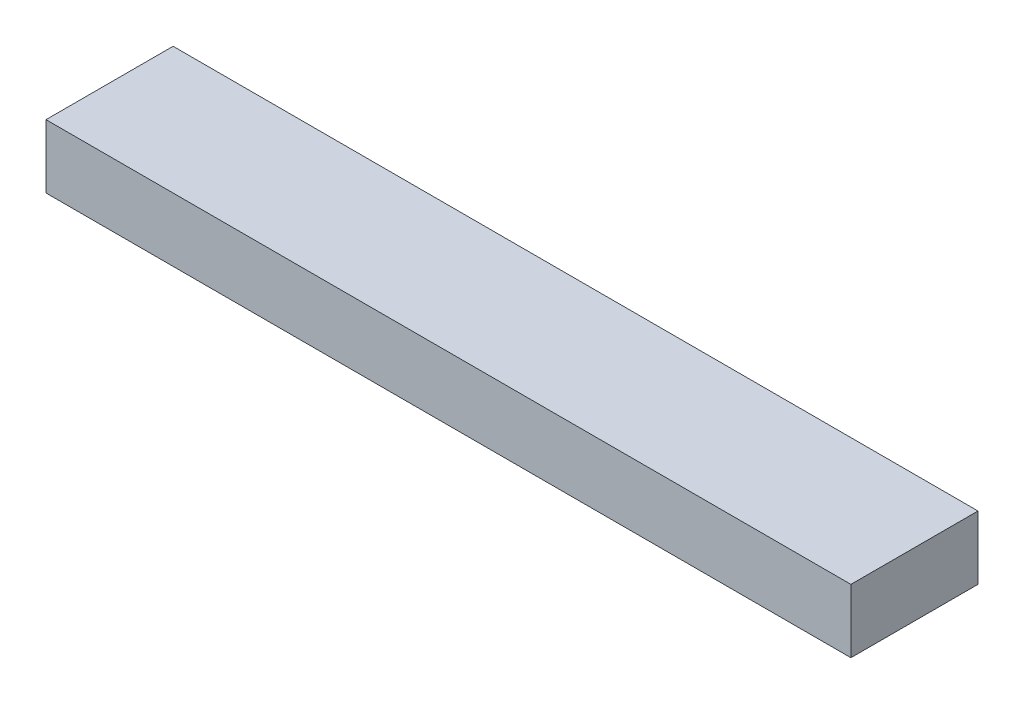
ISO-10303-21;
HEADER;
FILE_DESCRIPTION(('STEP AP214'),'2;1');
FILE_NAME('part.step','',(''),(''),'','','');
FILE_SCHEMA(('AUTOMOTIVE_DESIGN { 1 0 10303 214 1 1 1 1 }'));
ENDSEC;
DATA;
#1=APPLICATION_CONTEXT('core data for automotive mechanical design processes');
#2=APPLICATION_PROTOCOL_DEFINITION('international standard','automotive_design',2000,#1);
#3=PRODUCT_CONTEXT('',#1,'mechanical');
#4=PRODUCT('Part','Part','',(#3));
#5=PRODUCT_RELATED_PRODUCT_CATEGORY('part','',(#4));
#6=PRODUCT_DEFINITION_FORMATION('','',#4);
#7=PRODUCT_DEFINITION_CONTEXT('part definition',#1,'design');
#8=PRODUCT_DEFINITION('design','',#6,#7);
#9=PRODUCT_DEFINITION_SHAPE('','',#8);
#10=(LENGTH_UNIT() NAMED_UNIT(*) SI_UNIT(.MILLI.,.METRE.));
#11=(NAMED_UNIT(*) PLANE_ANGLE_UNIT() SI_UNIT($,.RADIAN.));
#12=(NAMED_UNIT(*) SI_UNIT($,.STERADIAN.) SOLID_ANGLE_UNIT());
#13=UNCERTAINTY_MEASURE_WITH_UNIT(LENGTH_MEASURE(1.E-05),#10,'distance_accuracy_value','');
#14=(GEOMETRIC_REPRESENTATION_CONTEXT(3) GLOBAL_UNCERTAINTY_ASSIGNED_CONTEXT((#13)) GLOBAL_UNIT_ASSIGNED_CONTEXT((#10,
#11,#12)) REPRESENTATION_CONTEXT('',''));
#15=CARTESIAN_POINT('',(0.,0.,0.));
#16=DIRECTION('',(0.,0.,1.));
#17=DIRECTION('',(1.,0.,0.));
#18=AXIS2_PLACEMENT_3D('',#15,#16,#17);
#19=CARTESIAN_POINT('',(151.999999999999,24.,24.0000000000008));
#20=DIRECTION('',(-1.,0.,0.));
#21=DIRECTION('',(0.,0.,1.00000000000003));
#22=AXIS2_PLACEMENT_3D('',#19,#20,#21);
#23=PLANE('',#22);
#24=DIRECTION('',(0.,0.,-1.00000000000003));
#25=VECTOR('',#24,1.);
#26=CARTESIAN_POINT('',(151.999999999999,0.,24.0000000000014));
#27=LINE('',#26,#25);
#28=CARTESIAN_POINT('',(151.999999999999,0.,24.0000000000014));
#29=VERTEX_POINT('',#28);
#30=CARTESIAN_POINT('',(151.999999999999,0.,-24.0000000000002));
#31=VERTEX_POINT('',#30);
#32=EDGE_CURVE('E110',#29,#31,#27,.T.);
#33=ORIENTED_EDGE('',*,*,#32,.T.);
#34=DIRECTION('',(0.,-1.00000000000003,0.));
#35=VECTOR('',#34,1.);
#36=CARTESIAN_POINT('',(151.999999999999,24.,-24.0000000000004));
#37=LINE('',#36,#35);
#38=CARTESIAN_POINT('',(151.999999999999,24.,-24.0000000000004));
#39=VERTEX_POINT('',#38);
#40=EDGE_CURVE('E11',#39,#31,#37,.T.);
#41=ORIENTED_EDGE('',*,*,#40,.F.);
#42=DIRECTION('',(0.,0.,-1.00000000000003));
#43=VECTOR('',#42,1.);
#44=CARTESIAN_POINT('',(151.999999999999,24.,24.0000000000008));
#45=LINE('',#44,#43);
#46=CARTESIAN_POINT('',(151.999999999999,24.,24.0000000000008));
#47=VERTEX_POINT('',#46);
#48=EDGE_CURVE('E93',#47,#39,#45,.T.);
#49=ORIENTED_EDGE('',*,*,#48,.F.);
#50=DIRECTION('',(0.,-1.00000000000003,0.));
#51=VECTOR('',#50,1.);
#52=CARTESIAN_POINT('',(151.999999999999,24.,24.0000000000008));
#53=LINE('',#52,#51);
#54=EDGE_CURVE('E106',#47,#29,#53,.T.);
#55=ORIENTED_EDGE('',*,*,#54,.T.);
#56=EDGE_LOOP('',(#33,#41,#49,#55));
#57=FACE_BOUND('',#56,.T.);
#58=ADVANCED_FACE('F41',(#57),#23,.F.);
#59=CARTESIAN_POINT('',(-152.000000000001,24.,-24.0000000000004));
#60=DIRECTION('',(0.,0.,1.00000000000003));
#61=DIRECTION('',(1.,0.,0.));
#62=AXIS2_PLACEMENT_3D('',#59,#60,#61);
#63=PLANE('',#62);
#64=DIRECTION('',(-1.,0.,0.));
#65=VECTOR('',#64,1.);
#66=CARTESIAN_POINT('',(-152.000000000001,0.,-24.0000000000002));
#67=LINE('',#66,#65);
#68=CARTESIAN_POINT('',(-152.000000000001,0.,-24.0000000000002));
#69=VERTEX_POINT('',#68);
#70=EDGE_CURVE('E98',#31,#69,#67,.T.);
#71=ORIENTED_EDGE('',*,*,#70,.T.);
#72=DIRECTION('',(0.,-1.00000000000003,0.));
#73=VECTOR('',#72,1.);
#74=CARTESIAN_POINT('',(-152.000000000001,24.,-24.0000000000004));
#75=LINE('',#74,#73);
#76=CARTESIAN_POINT('',(-152.000000000001,24.,-24.0000000000004));
#77=VERTEX_POINT('',#76);
#78=EDGE_CURVE('E50',#77,#69,#75,.T.);
#79=ORIENTED_EDGE('',*,*,#78,.F.);
#80=DIRECTION('',(-1.,0.,0.));
#81=VECTOR('',#80,1.);
#82=CARTESIAN_POINT('',(-152.000000000001,24.,-24.0000000000004));
#83=LINE('',#82,#81);
#84=EDGE_CURVE('E88',#39,#77,#83,.T.);
#85=ORIENTED_EDGE('',*,*,#84,.F.);
#86=ORIENTED_EDGE('',*,*,#40,.T.);
#87=EDGE_LOOP('',(#71,#79,#85,#86));
#88=FACE_BOUND('',#87,.T.);
#89=ADVANCED_FACE('F97',(#88),#63,.F.);
#90=CARTESIAN_POINT('',(-152.000000000001,24.,24.0000000000008));
#91=DIRECTION('',(1.,0.,0.));
#92=DIRECTION('',(0.,0.,-1.00000000000003));
#93=AXIS2_PLACEMENT_3D('',#90,#91,#92);
#94=PLANE('',#93);
#95=DIRECTION('',(0.,0.,1.00000000000003));
#96=VECTOR('',#95,1.);
#97=CARTESIAN_POINT('',(-152.000000000001,0.,24.0000000000014));
#98=LINE('',#97,#96);
#99=CARTESIAN_POINT('',(-152.000000000001,0.,24.0000000000014));
#100=VERTEX_POINT('',#99);
#101=EDGE_CURVE('E75',#69,#100,#98,.T.);
#102=ORIENTED_EDGE('',*,*,#101,.T.);
#103=DIRECTION('',(0.,-1.00000000000003,0.));
#104=VECTOR('',#103,1.);
#105=CARTESIAN_POINT('',(-152.000000000001,24.,24.0000000000008));
#106=LINE('',#105,#104);
#107=CARTESIAN_POINT('',(-152.000000000001,24.,24.0000000000008));
#108=VERTEX_POINT('',#107);
#109=EDGE_CURVE('E100',#108,#100,#106,.T.);
#110=ORIENTED_EDGE('',*,*,#109,.F.);
#111=DIRECTION('',(0.,0.,1.00000000000003));
#112=VECTOR('',#111,1.);
#113=CARTESIAN_POINT('',(-152.000000000001,24.,24.0000000000008));
#114=LINE('',#113,#112);
#115=EDGE_CURVE('E91',#77,#108,#114,.T.);
#116=ORIENTED_EDGE('',*,*,#115,.F.);
#117=ORIENTED_EDGE('',*,*,#78,.T.);
#118=EDGE_LOOP('',(#102,#110,#116,#117));
#119=FACE_BOUND('',#118,.T.);
#120=ADVANCED_FACE('F101',(#119),#94,.F.);
#121=CARTESIAN_POINT('',(-152.000000000001,24.,24.0000000000008));
#122=DIRECTION('',(0.,0.,-1.00000000000003));
#123=DIRECTION('',(-1.,0.,0.));
#124=AXIS2_PLACEMENT_3D('',#121,#122,#123);
#125=PLANE('',#124);
#126=DIRECTION('',(1.,0.,0.));
#127=VECTOR('',#126,1.);
#128=CARTESIAN_POINT('',(-152.000000000001,0.,24.0000000000014));
#129=LINE('',#128,#127);
#130=EDGE_CURVE('E81',#100,#29,#129,.T.);
#131=ORIENTED_EDGE('',*,*,#130,.T.);
#132=ORIENTED_EDGE('',*,*,#54,.F.);
#133=DIRECTION('',(1.,0.,0.));
#134=VECTOR('',#133,1.);
#135=CARTESIAN_POINT('',(-152.000000000001,24.,24.0000000000008));
#136=LINE('',#135,#134);
#137=EDGE_CURVE('E58',#108,#47,#136,.T.);
#138=ORIENTED_EDGE('',*,*,#137,.F.);
#139=ORIENTED_EDGE('',*,*,#109,.T.);
#140=EDGE_LOOP('',(#131,#132,#138,#139));
#141=FACE_BOUND('',#140,.T.);
#142=ADVANCED_FACE('F124',(#141),#125,.F.);
#143=CARTESIAN_POINT('',(0.,24.,0.));
#144=DIRECTION('',(0.,-1.00000000000003,0.));
#145=DIRECTION('',(0.,0.,-1.00000000000003));
#146=AXIS2_PLACEMENT_3D('',#143,#144,#145);
#147=PLANE('',#146);
#148=ORIENTED_EDGE('',*,*,#48,.T.);
#149=ORIENTED_EDGE('',*,*,#84,.T.);
#150=ORIENTED_EDGE('',*,*,#115,.T.);
#151=ORIENTED_EDGE('',*,*,#137,.T.);
#152=EDGE_LOOP('',(#148,#149,#150,#151));
#153=FACE_BOUND('',#152,.T.);
#154=ADVANCED_FACE('F89',(#153),#147,.F.);
#155=CARTESIAN_POINT('',(0.,0.,0.));
#156=DIRECTION('',(0.,-1.00000000000003,0.));
#157=DIRECTION('',(0.,0.,-1.00000000000003));
#158=AXIS2_PLACEMENT_3D('',#155,#156,#157);
#159=PLANE('',#158);
#160=ORIENTED_EDGE('',*,*,#32,.F.);
#161=ORIENTED_EDGE('',*,*,#130,.F.);
#162=ORIENTED_EDGE('',*,*,#101,.F.);
#163=ORIENTED_EDGE('',*,*,#70,.F.);
#164=EDGE_LOOP('',(#160,#161,#162,#163));
#165=FACE_BOUND('',#164,.T.);
#166=ADVANCED_FACE('F127',(#165),#159,.T.);
#167=CLOSED_SHELL('',(#58,#89,#120,#142,#154,#166));
#168=MANIFOLD_SOLID_BREP('B2',#167);
#169=ADVANCED_BREP_SHAPE_REPRESENTATION('',(#18,#168),#14);
#170=SHAPE_DEFINITION_REPRESENTATION(#9,#169);
ENDSEC;
END-ISO-10303-21;
